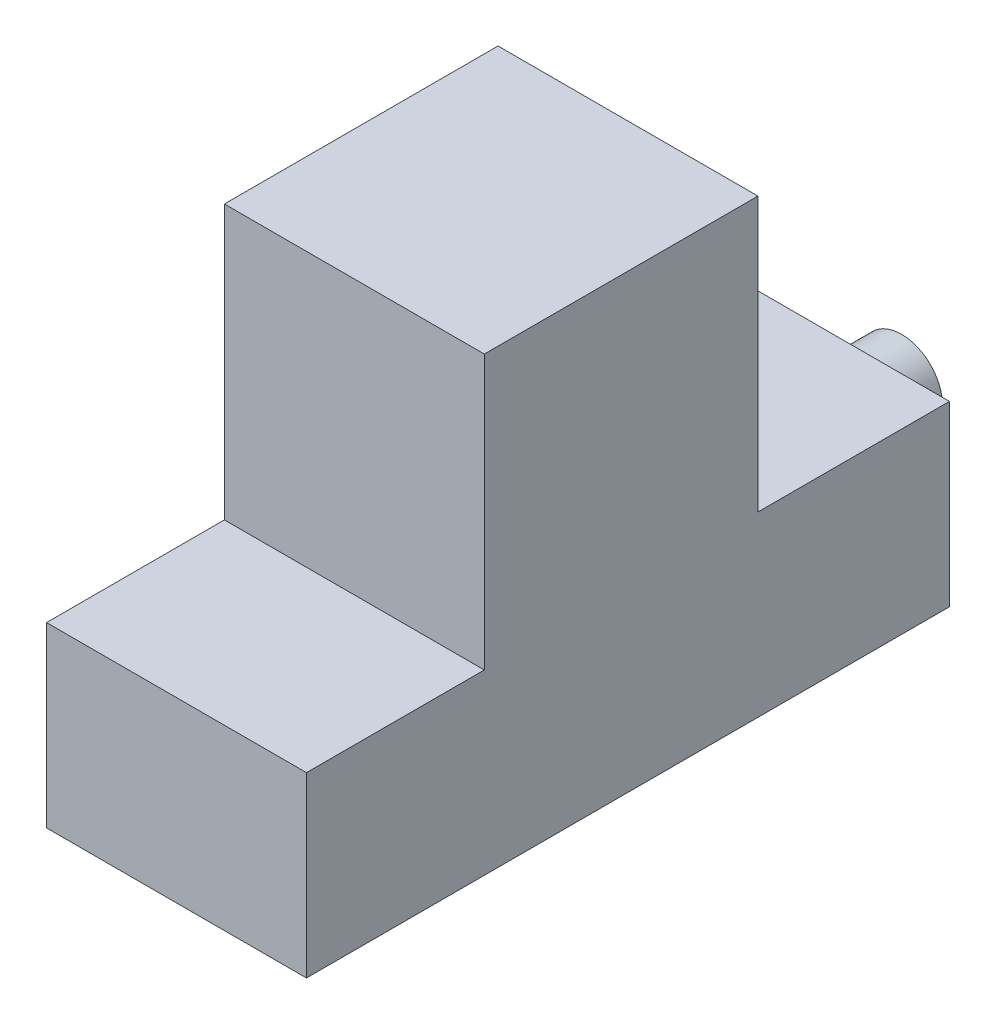
ISO-10303-21;
HEADER;
FILE_DESCRIPTION(('STEP AP214'),'2;1');
FILE_NAME('part.step','',(''),(''),'','','');
FILE_SCHEMA(('AUTOMOTIVE_DESIGN { 1 0 10303 214 1 1 1 1 }'));
ENDSEC;
DATA;
#1=APPLICATION_CONTEXT('core data for automotive mechanical design processes');
#2=APPLICATION_PROTOCOL_DEFINITION('international standard','automotive_design',2000,#1);
#3=PRODUCT_CONTEXT('',#1,'mechanical');
#4=PRODUCT('Part','Part','',(#3));
#5=PRODUCT_RELATED_PRODUCT_CATEGORY('part','',(#4));
#6=PRODUCT_DEFINITION_FORMATION('','',#4);
#7=PRODUCT_DEFINITION_CONTEXT('part definition',#1,'design');
#8=PRODUCT_DEFINITION('design','',#6,#7);
#9=PRODUCT_DEFINITION_SHAPE('','',#8);
#10=(LENGTH_UNIT() NAMED_UNIT(*) SI_UNIT(.MILLI.,.METRE.));
#11=(NAMED_UNIT(*) PLANE_ANGLE_UNIT() SI_UNIT($,.RADIAN.));
#12=(NAMED_UNIT(*) SI_UNIT($,.STERADIAN.) SOLID_ANGLE_UNIT());
#13=UNCERTAINTY_MEASURE_WITH_UNIT(LENGTH_MEASURE(1.E-05),#10,'distance_accuracy_value','');
#14=(GEOMETRIC_REPRESENTATION_CONTEXT(3) GLOBAL_UNCERTAINTY_ASSIGNED_CONTEXT((#13)) GLOBAL_UNIT_ASSIGNED_CONTEXT((#10,
#11,#12)) REPRESENTATION_CONTEXT('',''));
#15=CARTESIAN_POINT('',(0.,0.,0.));
#16=DIRECTION('',(0.,0.,1.));
#17=DIRECTION('',(1.,0.,0.));
#18=AXIS2_PLACEMENT_3D('',#15,#16,#17);
#19=CARTESIAN_POINT('',(-4.75,3.25,-12.));
#20=DIRECTION('',(0.,1.,0.));
#21=DIRECTION('',(0.,0.,1.));
#22=AXIS2_PLACEMENT_3D('',#19,#20,#21);
#23=PLANE('',#22);
#24=DIRECTION('',(1.,0.,0.));
#25=VECTOR('',#24,1.);
#26=CARTESIAN_POINT('',(-4.75,3.25,5.));
#27=LINE('',#26,#25);
#28=CARTESIAN_POINT('',(-4.75,3.25,5.));
#29=VERTEX_POINT('',#28);
#30=CARTESIAN_POINT('',(4.75,3.25,5.));
#31=VERTEX_POINT('',#30);
#32=EDGE_CURVE('E155',#29,#31,#27,.T.);
#33=ORIENTED_EDGE('',*,*,#32,.F.);
#34=DIRECTION('',(0.,0.,1.));
#35=VECTOR('',#34,1.);
#36=CARTESIAN_POINT('',(-4.75,3.25,-12.));
#37=LINE('',#36,#35);
#38=CARTESIAN_POINT('',(-4.75,3.25,11.5));
#39=VERTEX_POINT('',#38);
#40=EDGE_CURVE('E199',#29,#39,#37,.T.);
#41=ORIENTED_EDGE('',*,*,#40,.T.);
#42=DIRECTION('',(-1.,0.,0.));
#43=VECTOR('',#42,1.);
#44=CARTESIAN_POINT('',(-4.75,3.25,11.5));
#45=LINE('',#44,#43);
#46=CARTESIAN_POINT('',(4.75,3.25,11.5));
#47=VERTEX_POINT('',#46);
#48=EDGE_CURVE('E138',#47,#39,#45,.T.);
#49=ORIENTED_EDGE('',*,*,#48,.F.);
#50=DIRECTION('',(0.,0.,1.));
#51=VECTOR('',#50,1.);
#52=CARTESIAN_POINT('',(4.75,3.25,-12.));
#53=LINE('',#52,#51);
#54=EDGE_CURVE('E63',#31,#47,#53,.T.);
#55=ORIENTED_EDGE('',*,*,#54,.F.);
#56=EDGE_LOOP('',(#33,#41,#49,#55));
#57=FACE_BOUND('',#56,.T.);
#58=ADVANCED_FACE('F45',(#57),#23,.T.);
#59=CARTESIAN_POINT('',(4.75,-3.25,-12.));
#60=DIRECTION('',(1.,0.,0.));
#61=DIRECTION('',(0.,0.,-1.));
#62=AXIS2_PLACEMENT_3D('',#59,#60,#61);
#63=PLANE('',#62);
#64=CARTESIAN_POINT('',(4.75,3.25,-12.));
#65=VERTEX_POINT('',#64);
#66=CARTESIAN_POINT('',(4.75,3.25,-5.));
#67=VERTEX_POINT('',#66);
#68=EDGE_CURVE('E49',#65,#67,#53,.T.);
#69=ORIENTED_EDGE('',*,*,#68,.T.);
#70=DIRECTION('',(0.,-1.,0.));
#71=VECTOR('',#70,1.);
#72=CARTESIAN_POINT('',(4.75,13.25,-5.));
#73=LINE('',#72,#71);
#74=CARTESIAN_POINT('',(4.75,13.25,-5.));
#75=VERTEX_POINT('',#74);
#76=EDGE_CURVE('E180',#75,#67,#73,.T.);
#77=ORIENTED_EDGE('',*,*,#76,.F.);
#78=DIRECTION('',(0.,0.,-1.));
#79=VECTOR('',#78,1.);
#80=CARTESIAN_POINT('',(4.75,13.25,-5.));
#81=LINE('',#80,#79);
#82=CARTESIAN_POINT('',(4.75,13.25,5.));
#83=VERTEX_POINT('',#82);
#84=EDGE_CURVE('E150',#83,#75,#81,.T.);
#85=ORIENTED_EDGE('',*,*,#84,.F.);
#86=DIRECTION('',(0.,-1.,0.));
#87=VECTOR('',#86,1.);
#88=CARTESIAN_POINT('',(4.75,13.25,5.));
#89=LINE('',#88,#87);
#90=EDGE_CURVE('E164',#83,#31,#89,.T.);
#91=ORIENTED_EDGE('',*,*,#90,.T.);
#92=ORIENTED_EDGE('',*,*,#54,.T.);
#93=DIRECTION('',(0.,1.,0.));
#94=VECTOR('',#93,1.);
#95=CARTESIAN_POINT('',(4.75,3.25,11.5));
#96=LINE('',#95,#94);
#97=CARTESIAN_POINT('',(4.75,-3.25,11.5));
#98=VERTEX_POINT('',#97);
#99=EDGE_CURVE('E134',#98,#47,#96,.T.);
#100=ORIENTED_EDGE('',*,*,#99,.F.);
#101=DIRECTION('',(0.,0.,1.));
#102=VECTOR('',#101,1.);
#103=CARTESIAN_POINT('',(4.75,-3.25,-12.));
#104=LINE('',#103,#102);
#105=CARTESIAN_POINT('',(4.75,-3.25,-12.));
#106=VERTEX_POINT('',#105);
#107=EDGE_CURVE('E55',#106,#98,#104,.T.);
#108=ORIENTED_EDGE('',*,*,#107,.F.);
#109=DIRECTION('',(0.,1.,0.));
#110=VECTOR('',#109,1.);
#111=CARTESIAN_POINT('',(4.75,-3.25,-12.));
#112=LINE('',#111,#110);
#113=EDGE_CURVE('E184',#106,#65,#112,.T.);
#114=ORIENTED_EDGE('',*,*,#113,.T.);
#115=EDGE_LOOP('',(#69,#77,#85,#91,#92,#100,#108,#114));
#116=FACE_BOUND('',#115,.T.);
#117=ADVANCED_FACE('F47',(#116),#63,.T.);
#118=CARTESIAN_POINT('',(-4.75,-3.25,-12.));
#119=DIRECTION('',(0.,-1.,0.));
#120=DIRECTION('',(0.,0.,-1.));
#121=AXIS2_PLACEMENT_3D('',#118,#119,#120);
#122=PLANE('',#121);
#123=ORIENTED_EDGE('',*,*,#107,.T.);
#124=DIRECTION('',(1.,0.,0.));
#125=VECTOR('',#124,1.);
#126=CARTESIAN_POINT('',(-4.75,-3.25,11.5));
#127=LINE('',#126,#125);
#128=CARTESIAN_POINT('',(-4.75,-3.25,11.5));
#129=VERTEX_POINT('',#128);
#130=EDGE_CURVE('E128',#129,#98,#127,.T.);
#131=ORIENTED_EDGE('',*,*,#130,.F.);
#132=DIRECTION('',(0.,0.,1.));
#133=VECTOR('',#132,1.);
#134=CARTESIAN_POINT('',(-4.75,-3.25,-12.));
#135=LINE('',#134,#133);
#136=CARTESIAN_POINT('',(-4.75,-3.25,-12.));
#137=VERTEX_POINT('',#136);
#138=EDGE_CURVE('E113',#137,#129,#135,.T.);
#139=ORIENTED_EDGE('',*,*,#138,.F.);
#140=DIRECTION('',(1.,0.,0.));
#141=VECTOR('',#140,1.);
#142=CARTESIAN_POINT('',(-4.75,-3.25,-12.));
#143=LINE('',#142,#141);
#144=EDGE_CURVE('E194',#137,#106,#143,.T.);
#145=ORIENTED_EDGE('',*,*,#144,.T.);
#146=EDGE_LOOP('',(#123,#131,#139,#145));
#147=FACE_BOUND('',#146,.T.);
#148=ADVANCED_FACE('F129',(#147),#122,.T.);
#149=CARTESIAN_POINT('',(-4.75,-3.25,-12.));
#150=DIRECTION('',(-1.,0.,0.));
#151=DIRECTION('',(0.,0.,1.));
#152=AXIS2_PLACEMENT_3D('',#149,#150,#151);
#153=PLANE('',#152);
#154=ORIENTED_EDGE('',*,*,#138,.T.);
#155=DIRECTION('',(0.,-1.,0.));
#156=VECTOR('',#155,1.);
#157=CARTESIAN_POINT('',(-4.75,3.25,11.5));
#158=LINE('',#157,#156);
#159=EDGE_CURVE('E118',#39,#129,#158,.T.);
#160=ORIENTED_EDGE('',*,*,#159,.F.);
#161=ORIENTED_EDGE('',*,*,#40,.F.);
#162=DIRECTION('',(0.,-1.,0.));
#163=VECTOR('',#162,1.);
#164=CARTESIAN_POINT('',(-4.75,13.25,5.));
#165=LINE('',#164,#163);
#166=CARTESIAN_POINT('',(-4.75,13.25,5.));
#167=VERTEX_POINT('',#166);
#168=EDGE_CURVE('E172',#167,#29,#165,.T.);
#169=ORIENTED_EDGE('',*,*,#168,.F.);
#170=DIRECTION('',(0.,0.,1.));
#171=VECTOR('',#170,1.);
#172=CARTESIAN_POINT('',(-4.75,13.25,5.));
#173=LINE('',#172,#171);
#174=CARTESIAN_POINT('',(-4.75,13.25,-5.));
#175=VERTEX_POINT('',#174);
#176=EDGE_CURVE('E158',#175,#167,#173,.T.);
#177=ORIENTED_EDGE('',*,*,#176,.F.);
#178=DIRECTION('',(0.,-1.,0.));
#179=VECTOR('',#178,1.);
#180=CARTESIAN_POINT('',(-4.75,13.25,-5.));
#181=LINE('',#180,#179);
#182=CARTESIAN_POINT('',(-4.75,3.25,-5.));
#183=VERTEX_POINT('',#182);
#184=EDGE_CURVE('E176',#175,#183,#181,.T.);
#185=ORIENTED_EDGE('',*,*,#184,.T.);
#186=CARTESIAN_POINT('',(-4.75,3.25,-12.));
#187=VERTEX_POINT('',#186);
#188=EDGE_CURVE('E125',#187,#183,#37,.T.);
#189=ORIENTED_EDGE('',*,*,#188,.F.);
#190=DIRECTION('',(0.,-1.,0.));
#191=VECTOR('',#190,1.);
#192=CARTESIAN_POINT('',(-4.75,-3.25,-12.));
#193=LINE('',#192,#191);
#194=EDGE_CURVE('E120',#187,#137,#193,.T.);
#195=ORIENTED_EDGE('',*,*,#194,.T.);
#196=EDGE_LOOP('',(#154,#160,#161,#169,#177,#185,#189,#195));
#197=FACE_BOUND('',#196,.T.);
#198=ADVANCED_FACE('F115',(#197),#153,.T.);
#199=DIRECTION('',(-1.,0.,0.));
#200=VECTOR('',#199,1.);
#201=CARTESIAN_POINT('',(-4.75,3.25,-5.));
#202=LINE('',#201,#200);
#203=EDGE_CURVE('E71',#67,#183,#202,.T.);
#204=ORIENTED_EDGE('',*,*,#203,.F.);
#205=ORIENTED_EDGE('',*,*,#68,.F.);
#206=DIRECTION('',(-1.,0.,0.));
#207=VECTOR('',#206,1.);
#208=CARTESIAN_POINT('',(-4.75,3.25,-12.));
#209=LINE('',#208,#207);
#210=EDGE_CURVE('E188',#65,#187,#209,.T.);
#211=ORIENTED_EDGE('',*,*,#210,.T.);
#212=ORIENTED_EDGE('',*,*,#188,.T.);
#213=EDGE_LOOP('',(#204,#205,#211,#212));
#214=FACE_BOUND('',#213,.T.);
#215=ADVANCED_FACE('F208',(#214),#23,.T.);
#216=CARTESIAN_POINT('',(0.,0.,-12.));
#217=DIRECTION('',(0.,0.,-1.));
#218=DIRECTION('',(-1.,0.,0.));
#219=AXIS2_PLACEMENT_3D('',#216,#217,#218);
#220=PLANE('',#219);
#221=CARTESIAN_POINT('',(0.,0.,-12.));
#222=DIRECTION('',(0.,0.,-1.));
#223=DIRECTION('',(-1.,0.,0.));
#224=AXIS2_PLACEMENT_3D('',#221,#222,#223);
#225=CIRCLE('',#224,1.5);
#226=CARTESIAN_POINT('',(-1.5,0.,-12.));
#227=VERTEX_POINT('',#226);
#228=EDGE_CURVE('E11',#227,#227,#225,.T.);
#229=ORIENTED_EDGE('',*,*,#228,.F.);
#230=EDGE_LOOP('',(#229));
#231=FACE_BOUND('',#230,.T.);
#232=ORIENTED_EDGE('',*,*,#113,.F.);
#233=ORIENTED_EDGE('',*,*,#144,.F.);
#234=ORIENTED_EDGE('',*,*,#194,.F.);
#235=ORIENTED_EDGE('',*,*,#210,.F.);
#236=EDGE_LOOP('',(#232,#233,#234,#235));
#237=FACE_BOUND('',#236,.T.);
#238=ADVANCED_FACE('F215',(#231,#237),#220,.T.);
#239=CARTESIAN_POINT('',(-4.75,13.25,-5.));
#240=DIRECTION('',(0.,0.,1.));
#241=DIRECTION('',(1.,0.,0.));
#242=AXIS2_PLACEMENT_3D('',#239,#240,#241);
#243=PLANE('',#242);
#244=ORIENTED_EDGE('',*,*,#203,.T.);
#245=ORIENTED_EDGE('',*,*,#184,.F.);
#246=DIRECTION('',(-1.,0.,0.));
#247=VECTOR('',#246,1.);
#248=CARTESIAN_POINT('',(-4.75,13.25,-5.));
#249=LINE('',#248,#247);
#250=EDGE_CURVE('E154',#75,#175,#249,.T.);
#251=ORIENTED_EDGE('',*,*,#250,.F.);
#252=ORIENTED_EDGE('',*,*,#76,.T.);
#253=EDGE_LOOP('',(#244,#245,#251,#252));
#254=FACE_BOUND('',#253,.T.);
#255=ADVANCED_FACE('F220',(#254),#243,.F.);
#256=CARTESIAN_POINT('',(-4.75,13.25,5.));
#257=DIRECTION('',(0.,0.,-1.));
#258=DIRECTION('',(-1.,0.,0.));
#259=AXIS2_PLACEMENT_3D('',#256,#257,#258);
#260=PLANE('',#259);
#261=ORIENTED_EDGE('',*,*,#32,.T.);
#262=ORIENTED_EDGE('',*,*,#90,.F.);
#263=DIRECTION('',(1.,0.,0.));
#264=VECTOR('',#263,1.);
#265=CARTESIAN_POINT('',(-4.75,13.25,5.));
#266=LINE('',#265,#264);
#267=EDGE_CURVE('E161',#167,#83,#266,.T.);
#268=ORIENTED_EDGE('',*,*,#267,.F.);
#269=ORIENTED_EDGE('',*,*,#168,.T.);
#270=EDGE_LOOP('',(#261,#262,#268,#269));
#271=FACE_BOUND('',#270,.T.);
#272=ADVANCED_FACE('F231',(#271),#260,.F.);
#273=CARTESIAN_POINT('',(0.,13.25,0.));
#274=DIRECTION('',(0.,1.,0.));
#275=DIRECTION('',(0.,0.,1.));
#276=AXIS2_PLACEMENT_3D('',#273,#274,#275);
#277=PLANE('',#276);
#278=ORIENTED_EDGE('',*,*,#84,.T.);
#279=ORIENTED_EDGE('',*,*,#250,.T.);
#280=ORIENTED_EDGE('',*,*,#176,.T.);
#281=ORIENTED_EDGE('',*,*,#267,.T.);
#282=EDGE_LOOP('',(#278,#279,#280,#281));
#283=FACE_BOUND('',#282,.T.);
#284=ADVANCED_FACE('F235',(#283),#277,.T.);
#285=CARTESIAN_POINT('',(0.,0.,-15.));
#286=DIRECTION('',(0.,0.,1.));
#287=DIRECTION('',(1.,0.,0.));
#288=AXIS2_PLACEMENT_3D('',#285,#286,#287);
#289=CYLINDRICAL_SURFACE('',#288,1.5);
#290=CARTESIAN_POINT('',(0.,0.,-15.));
#291=DIRECTION('',(0.,0.,-1.));
#292=DIRECTION('',(-1.,0.,0.));
#293=AXIS2_PLACEMENT_3D('',#290,#291,#292);
#294=CIRCLE('',#293,1.5);
#295=CARTESIAN_POINT('',(-1.5,0.,-15.));
#296=VERTEX_POINT('',#295);
#297=EDGE_CURVE('E146',#296,#296,#294,.T.);
#298=ORIENTED_EDGE('',*,*,#297,.F.);
#299=EDGE_LOOP('',(#298));
#300=FACE_BOUND('',#299,.T.);
#301=ORIENTED_EDGE('',*,*,#228,.T.);
#302=EDGE_LOOP('',(#301));
#303=FACE_BOUND('',#302,.T.);
#304=ADVANCED_FACE('F239',(#300,#303),#289,.T.);
#305=CARTESIAN_POINT('',(0.,0.,-15.));
#306=DIRECTION('',(0.,0.,-1.));
#307=DIRECTION('',(-1.,0.,0.));
#308=AXIS2_PLACEMENT_3D('',#305,#306,#307);
#309=PLANE('',#308);
#310=ORIENTED_EDGE('',*,*,#297,.T.);
#311=EDGE_LOOP('',(#310));
#312=FACE_BOUND('',#311,.T.);
#313=ADVANCED_FACE('F243',(#312),#309,.T.);
#314=CARTESIAN_POINT('',(0.,0.,11.5));
#315=DIRECTION('',(0.,0.,1.));
#316=DIRECTION('',(1.,0.,0.));
#317=AXIS2_PLACEMENT_3D('',#314,#315,#316);
#318=PLANE('',#317);
#319=ORIENTED_EDGE('',*,*,#159,.T.);
#320=ORIENTED_EDGE('',*,*,#130,.T.);
#321=ORIENTED_EDGE('',*,*,#99,.T.);
#322=ORIENTED_EDGE('',*,*,#48,.T.);
#323=EDGE_LOOP('',(#319,#320,#321,#322));
#324=FACE_BOUND('',#323,.T.);
#325=ADVANCED_FACE('F137',(#324),#318,.T.);
#326=CLOSED_SHELL('',(#58,#117,#148,#198,#215,#238,#255,#272,#284,#304,#313,#325));
#327=MANIFOLD_SOLID_BREP('B2',#326);
#328=ADVANCED_BREP_SHAPE_REPRESENTATION('',(#18,#327),#14);
#329=SHAPE_DEFINITION_REPRESENTATION(#9,#328);
ENDSEC;
END-ISO-10303-21;
